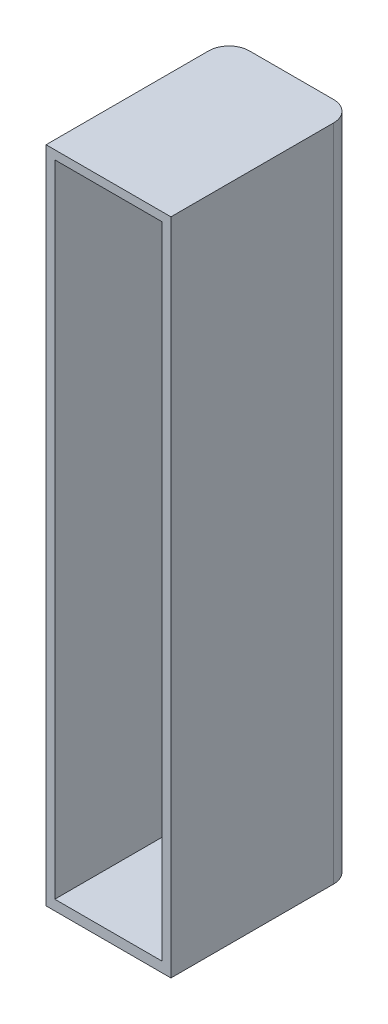
ISO-10303-21;
HEADER;
FILE_DESCRIPTION(('STEP AP214'),'2;1');
FILE_NAME('part.step','',(''),(''),'','','');
FILE_SCHEMA(('AUTOMOTIVE_DESIGN { 1 0 10303 214 1 1 1 1 }'));
ENDSEC;
DATA;
#1=APPLICATION_CONTEXT('core data for automotive mechanical design processes');
#2=APPLICATION_PROTOCOL_DEFINITION('international standard','automotive_design',2000,#1);
#3=PRODUCT_CONTEXT('',#1,'mechanical');
#4=PRODUCT('Part','Part','',(#3));
#5=PRODUCT_RELATED_PRODUCT_CATEGORY('part','',(#4));
#6=PRODUCT_DEFINITION_FORMATION('','',#4);
#7=PRODUCT_DEFINITION_CONTEXT('part definition',#1,'design');
#8=PRODUCT_DEFINITION('design','',#6,#7);
#9=PRODUCT_DEFINITION_SHAPE('','',#8);
#10=(LENGTH_UNIT() NAMED_UNIT(*) SI_UNIT(.MILLI.,.METRE.));
#11=(NAMED_UNIT(*) PLANE_ANGLE_UNIT() SI_UNIT($,.RADIAN.));
#12=(NAMED_UNIT(*) SI_UNIT($,.STERADIAN.) SOLID_ANGLE_UNIT());
#13=UNCERTAINTY_MEASURE_WITH_UNIT(LENGTH_MEASURE(1.E-05),#10,'distance_accuracy_value','');
#14=(GEOMETRIC_REPRESENTATION_CONTEXT(3) GLOBAL_UNCERTAINTY_ASSIGNED_CONTEXT((#13)) GLOBAL_UNIT_ASSIGNED_CONTEXT((#10,
#11,#12)) REPRESENTATION_CONTEXT('',''));
#15=CARTESIAN_POINT('',(0.,0.,0.));
#16=DIRECTION('',(0.,0.,1.));
#17=DIRECTION('',(1.,0.,0.));
#18=AXIS2_PLACEMENT_3D('',#15,#16,#17);
#19=CARTESIAN_POINT('',(-10.75,-0.00999999999999612,15.));
#20=DIRECTION('',(0.,0.,1.));
#21=DIRECTION('',(1.,0.,0.));
#22=AXIS2_PLACEMENT_3D('',#19,#20,#21);
#23=PLANE('',#22);
#24=DIRECTION('',(0.,-1.,0.));
#25=VECTOR('',#24,1.);
#26=CARTESIAN_POINT('',(-9.25,113.5,15.));
#27=LINE('',#26,#25);
#28=CARTESIAN_POINT('',(-9.25,112.,15.));
#29=VERTEX_POINT('',#28);
#30=CARTESIAN_POINT('',(-9.25,1.75000000000003,15.));
#31=VERTEX_POINT('',#30);
#32=EDGE_CURVE('E213',#29,#31,#27,.T.);
#33=ORIENTED_EDGE('',*,*,#32,.F.);
#34=DIRECTION('',(-1.,0.,0.));
#35=VECTOR('',#34,1.);
#36=CARTESIAN_POINT('',(-7.25,112.,15.));
#37=LINE('',#36,#35);
#38=CARTESIAN_POINT('',(9.25,112.,15.));
#39=VERTEX_POINT('',#38);
#40=EDGE_CURVE('E217',#39,#29,#37,.T.);
#41=ORIENTED_EDGE('',*,*,#40,.F.);
#42=DIRECTION('',(0.,-1.,0.));
#43=VECTOR('',#42,1.);
#44=CARTESIAN_POINT('',(9.25,113.5,15.));
#45=LINE('',#44,#43);
#46=CARTESIAN_POINT('',(9.25,1.75,15.));
#47=VERTEX_POINT('',#46);
#48=EDGE_CURVE('E45',#39,#47,#45,.T.);
#49=ORIENTED_EDGE('',*,*,#48,.T.);
#50=DIRECTION('',(1.,0.,0.));
#51=VECTOR('',#50,1.);
#52=CARTESIAN_POINT('',(-9.25,1.75,15.));
#53=LINE('',#52,#51);
#54=EDGE_CURVE('E206',#31,#47,#53,.T.);
#55=ORIENTED_EDGE('',*,*,#54,.F.);
#56=EDGE_LOOP('',(#33,#41,#49,#55));
#57=FACE_BOUND('',#56,.T.);
#58=DIRECTION('',(-1.,0.,0.));
#59=VECTOR('',#58,1.);
#60=CARTESIAN_POINT('',(7.25,0.,15.));
#61=LINE('',#60,#59);
#62=CARTESIAN_POINT('',(10.75,0.,15.));
#63=VERTEX_POINT('',#62);
#64=CARTESIAN_POINT('',(-10.75,0.,15.));
#65=VERTEX_POINT('',#64);
#66=EDGE_CURVE('E195',#63,#65,#61,.T.);
#67=ORIENTED_EDGE('',*,*,#66,.F.);
#68=DIRECTION('',(0.,-1.,0.));
#69=VECTOR('',#68,1.);
#70=CARTESIAN_POINT('',(10.75,113.5,15.));
#71=LINE('',#70,#69);
#72=CARTESIAN_POINT('',(10.75,113.5,15.));
#73=VERTEX_POINT('',#72);
#74=EDGE_CURVE('E210',#73,#63,#71,.T.);
#75=ORIENTED_EDGE('',*,*,#74,.F.);
#76=DIRECTION('',(1.,0.,0.));
#77=VECTOR('',#76,1.);
#78=CARTESIAN_POINT('',(-7.25,113.5,15.));
#79=LINE('',#78,#77);
#80=CARTESIAN_POINT('',(-10.75,113.5,15.));
#81=VERTEX_POINT('',#80);
#82=EDGE_CURVE('E199',#81,#73,#79,.T.);
#83=ORIENTED_EDGE('',*,*,#82,.F.);
#84=DIRECTION('',(0.,-1.,0.));
#85=VECTOR('',#84,1.);
#86=CARTESIAN_POINT('',(-10.75,113.5,15.));
#87=LINE('',#86,#85);
#88=EDGE_CURVE('E184',#81,#65,#87,.T.);
#89=ORIENTED_EDGE('',*,*,#88,.T.);
#90=EDGE_LOOP('',(#67,#75,#83,#89));
#91=FACE_BOUND('',#90,.T.);
#92=ADVANCED_FACE('F41',(#57,#91),#23,.T.);
#93=CARTESIAN_POINT('',(8.34999999999999,106.5,16.501));
#94=DIRECTION('',(1.,0.,0.));
#95=DIRECTION('',(0.,1.,0.));
#96=AXIS2_PLACEMENT_3D('',#93,#94,#95);
#97=PLANE('',#96);
#98=DIRECTION('',(0.,-1.,0.));
#99=VECTOR('',#98,1.);
#100=CARTESIAN_POINT('',(8.34999999999999,113.5,-16.3226495451672));
#101=LINE('',#100,#99);
#102=CARTESIAN_POINT('',(8.34999999999999,106.5,-16.3226495451672));
#103=VERTEX_POINT('',#102);
#104=CARTESIAN_POINT('',(8.34999999999999,72.5,-16.3226495451672));
#105=VERTEX_POINT('',#104);
#106=EDGE_CURVE('E50',#103,#105,#101,.T.);
#107=ORIENTED_EDGE('',*,*,#106,.T.);
#108=DIRECTION('',(0.,0.,-1.));
#109=VECTOR('',#108,1.);
#110=CARTESIAN_POINT('',(8.34999999999999,72.5,16.501));
#111=LINE('',#110,#109);
#112=CARTESIAN_POINT('',(8.34999999999999,72.5,-14.670329308849));
#113=VERTEX_POINT('',#112);
#114=EDGE_CURVE('E251',#113,#105,#111,.T.);
#115=ORIENTED_EDGE('',*,*,#114,.F.);
#116=DIRECTION('',(0.,-1.,0.));
#117=VECTOR('',#116,1.);
#118=CARTESIAN_POINT('',(8.34999999999999,113.5,-14.670329308849));
#119=LINE('',#118,#117);
#120=CARTESIAN_POINT('',(8.34999999999999,106.5,-14.670329308849));
#121=VERTEX_POINT('',#120);
#122=EDGE_CURVE('E230',#121,#113,#119,.T.);
#123=ORIENTED_EDGE('',*,*,#122,.F.);
#124=DIRECTION('',(0.,0.,-1.));
#125=VECTOR('',#124,1.);
#126=CARTESIAN_POINT('',(8.34999999999999,106.5,16.501));
#127=LINE('',#126,#125);
#128=EDGE_CURVE('E254',#121,#103,#127,.T.);
#129=ORIENTED_EDGE('',*,*,#128,.T.);
#130=EDGE_LOOP('',(#107,#115,#123,#129));
#131=FACE_BOUND('',#130,.T.);
#132=ADVANCED_FACE('F391',(#131),#97,.F.);
#133=CARTESIAN_POINT('',(8.34999999999999,72.5,16.501));
#134=DIRECTION('',(0.,-1.,0.));
#135=DIRECTION('',(0.,0.,-1.));
#136=AXIS2_PLACEMENT_3D('',#133,#134,#135);
#137=PLANE('',#136);
#138=CARTESIAN_POINT('',(-7.25,72.5,-13.));
#139=DIRECTION('',(0.,-1.,0.));
#140=DIRECTION('',(0.,0.,-1.));
#141=AXIS2_PLACEMENT_3D('',#138,#139,#140);
#142=CIRCLE('',#141,3.5);
#143=CARTESIAN_POINT('',(-7.24999999999999,72.5,-16.5));
#144=VERTEX_POINT('',#143);
#145=CARTESIAN_POINT('',(-8.35,72.5,-16.3226495451672));
#146=VERTEX_POINT('',#145);
#147=EDGE_CURVE('E228',#144,#146,#142,.F.);
#148=ORIENTED_EDGE('',*,*,#147,.T.);
#149=DIRECTION('',(0.,0.,-1.));
#150=VECTOR('',#149,1.);
#151=CARTESIAN_POINT('',(-8.35000000000001,72.5,16.501));
#152=LINE('',#151,#150);
#153=CARTESIAN_POINT('',(-8.35,72.5,-14.670329308849));
#154=VERTEX_POINT('',#153);
#155=EDGE_CURVE('E248',#154,#146,#152,.T.);
#156=ORIENTED_EDGE('',*,*,#155,.F.);
#157=CARTESIAN_POINT('',(-7.25,72.5,-13.));
#158=DIRECTION('',(0.,-1.,0.));
#159=DIRECTION('',(0.,0.,-1.));
#160=AXIS2_PLACEMENT_3D('',#157,#158,#159);
#161=CIRCLE('',#160,2.);
#162=CARTESIAN_POINT('',(-7.24999999999999,72.5,-15.));
#163=VERTEX_POINT('',#162);
#164=EDGE_CURVE('E242',#163,#154,#161,.F.);
#165=ORIENTED_EDGE('',*,*,#164,.F.);
#166=DIRECTION('',(-1.,0.,0.));
#167=VECTOR('',#166,1.);
#168=CARTESIAN_POINT('',(8.34999999999999,72.5,-15.));
#169=LINE('',#168,#167);
#170=CARTESIAN_POINT('',(7.24999999999998,72.5,-15.));
#171=VERTEX_POINT('',#170);
#172=EDGE_CURVE('E236',#171,#163,#169,.T.);
#173=ORIENTED_EDGE('',*,*,#172,.F.);
#174=CARTESIAN_POINT('',(7.25,72.5,-13.));
#175=DIRECTION('',(0.,-1.,0.));
#176=DIRECTION('',(0.,0.,-1.));
#177=AXIS2_PLACEMENT_3D('',#174,#175,#176);
#178=CIRCLE('',#177,2.);
#179=EDGE_CURVE('E233',#113,#171,#178,.F.);
#180=ORIENTED_EDGE('',*,*,#179,.F.);
#181=ORIENTED_EDGE('',*,*,#114,.T.);
#182=CARTESIAN_POINT('',(7.25,72.5,-13.));
#183=DIRECTION('',(0.,-1.,0.));
#184=DIRECTION('',(0.,0.,-1.));
#185=AXIS2_PLACEMENT_3D('',#182,#183,#184);
#186=CIRCLE('',#185,3.5);
#187=CARTESIAN_POINT('',(7.24999999999997,72.5,-16.5));
#188=VERTEX_POINT('',#187);
#189=EDGE_CURVE('E222',#105,#188,#186,.F.);
#190=ORIENTED_EDGE('',*,*,#189,.T.);
#191=DIRECTION('',(-1.,0.,0.));
#192=VECTOR('',#191,1.);
#193=CARTESIAN_POINT('',(8.34999999999999,72.5,-16.5));
#194=LINE('',#193,#192);
#195=EDGE_CURVE('E65',#188,#144,#194,.T.);
#196=ORIENTED_EDGE('',*,*,#195,.T.);
#197=EDGE_LOOP('',(#148,#156,#165,#173,#180,#181,#190,#196));
#198=FACE_BOUND('',#197,.T.);
#199=ADVANCED_FACE('F366',(#198),#137,.F.);
#200=CARTESIAN_POINT('',(-8.35,106.5,16.501));
#201=DIRECTION('',(-1.,0.,0.));
#202=DIRECTION('',(0.,-1.,0.));
#203=AXIS2_PLACEMENT_3D('',#200,#201,#202);
#204=PLANE('',#203);
#205=DIRECTION('',(0.,-1.,0.));
#206=VECTOR('',#205,1.);
#207=CARTESIAN_POINT('',(-8.35,113.5,-16.3226495451672));
#208=LINE('',#207,#206);
#209=CARTESIAN_POINT('',(-8.35,106.5,-16.3226495451672));
#210=VERTEX_POINT('',#209);
#211=EDGE_CURVE('E226',#146,#210,#208,.F.);
#212=ORIENTED_EDGE('',*,*,#211,.T.);
#213=DIRECTION('',(0.,0.,-1.));
#214=VECTOR('',#213,1.);
#215=CARTESIAN_POINT('',(-8.35,106.5,16.501));
#216=LINE('',#215,#214);
#217=CARTESIAN_POINT('',(-8.35,106.5,-14.670329308849));
#218=VERTEX_POINT('',#217);
#219=EDGE_CURVE('E247',#218,#210,#216,.T.);
#220=ORIENTED_EDGE('',*,*,#219,.F.);
#221=DIRECTION('',(0.,-1.,0.));
#222=VECTOR('',#221,1.);
#223=CARTESIAN_POINT('',(-8.35,113.5,-14.670329308849));
#224=LINE('',#223,#222);
#225=EDGE_CURVE('E239',#154,#218,#224,.F.);
#226=ORIENTED_EDGE('',*,*,#225,.F.);
#227=ORIENTED_EDGE('',*,*,#155,.T.);
#228=EDGE_LOOP('',(#212,#220,#226,#227));
#229=FACE_BOUND('',#228,.T.);
#230=ADVANCED_FACE('F364',(#229),#204,.F.);
#231=CARTESIAN_POINT('',(8.34999999999999,106.5,16.501));
#232=DIRECTION('',(0.,1.,0.));
#233=DIRECTION('',(0.,0.,1.));
#234=AXIS2_PLACEMENT_3D('',#231,#232,#233);
#235=PLANE('',#234);
#236=CARTESIAN_POINT('',(-7.25,106.5,-13.));
#237=DIRECTION('',(0.,1.,0.));
#238=DIRECTION('',(0.,0.,1.));
#239=AXIS2_PLACEMENT_3D('',#236,#237,#238);
#240=CIRCLE('',#239,3.5);
#241=CARTESIAN_POINT('',(-7.25,106.5,-16.5));
#242=VERTEX_POINT('',#241);
#243=EDGE_CURVE('E224',#210,#242,#240,.F.);
#244=ORIENTED_EDGE('',*,*,#243,.T.);
#245=DIRECTION('',(1.,0.,0.));
#246=VECTOR('',#245,1.);
#247=CARTESIAN_POINT('',(8.34999999999999,106.5,-16.5));
#248=LINE('',#247,#246);
#249=CARTESIAN_POINT('',(7.24999999999997,106.5,-16.5));
#250=VERTEX_POINT('',#249);
#251=EDGE_CURVE('E57',#242,#250,#248,.T.);
#252=ORIENTED_EDGE('',*,*,#251,.T.);
#253=CARTESIAN_POINT('',(7.25,106.5,-13.));
#254=DIRECTION('',(0.,1.,0.));
#255=DIRECTION('',(0.,0.,1.));
#256=AXIS2_PLACEMENT_3D('',#253,#254,#255);
#257=CIRCLE('',#256,3.5);
#258=EDGE_CURVE('E11',#250,#103,#257,.F.);
#259=ORIENTED_EDGE('',*,*,#258,.T.);
#260=ORIENTED_EDGE('',*,*,#128,.F.);
#261=CARTESIAN_POINT('',(7.25,106.5,-13.));
#262=DIRECTION('',(0.,1.,0.));
#263=DIRECTION('',(0.,0.,1.));
#264=AXIS2_PLACEMENT_3D('',#261,#262,#263);
#265=CIRCLE('',#264,2.);
#266=CARTESIAN_POINT('',(7.24999999999998,106.5,-15.));
#267=VERTEX_POINT('',#266);
#268=EDGE_CURVE('E252',#267,#121,#265,.F.);
#269=ORIENTED_EDGE('',*,*,#268,.F.);
#270=DIRECTION('',(1.,0.,0.));
#271=VECTOR('',#270,1.);
#272=CARTESIAN_POINT('',(8.34999999999999,106.5,-15.));
#273=LINE('',#272,#271);
#274=CARTESIAN_POINT('',(-7.24999999999999,106.5,-15.));
#275=VERTEX_POINT('',#274);
#276=EDGE_CURVE('E260',#275,#267,#273,.T.);
#277=ORIENTED_EDGE('',*,*,#276,.F.);
#278=CARTESIAN_POINT('',(-7.25,106.5,-13.));
#279=DIRECTION('',(0.,1.,0.));
#280=DIRECTION('',(0.,0.,1.));
#281=AXIS2_PLACEMENT_3D('',#278,#279,#280);
#282=CIRCLE('',#281,2.);
#283=EDGE_CURVE('E263',#218,#275,#282,.F.);
#284=ORIENTED_EDGE('',*,*,#283,.F.);
#285=ORIENTED_EDGE('',*,*,#219,.T.);
#286=EDGE_LOOP('',(#244,#252,#259,#260,#269,#277,#284,#285));
#287=FACE_BOUND('',#286,.T.);
#288=ADVANCED_FACE('F356',(#287),#235,.F.);
#289=CARTESIAN_POINT('',(-7.24999999999999,113.5,-16.5));
#290=DIRECTION('',(0.,0.,1.));
#291=DIRECTION('',(1.,0.,0.));
#292=AXIS2_PLACEMENT_3D('',#289,#290,#291);
#293=PLANE('',#292);
#294=DIRECTION('',(0.,-1.,0.));
#295=VECTOR('',#294,1.);
#296=CARTESIAN_POINT('',(7.24999999999997,113.5,-16.5));
#297=LINE('',#296,#295);
#298=CARTESIAN_POINT('',(7.24999999999997,113.5,-16.5));
#299=VERTEX_POINT('',#298);
#300=EDGE_CURVE('E313',#299,#250,#297,.T.);
#301=ORIENTED_EDGE('',*,*,#300,.T.);
#302=ORIENTED_EDGE('',*,*,#251,.F.);
#303=DIRECTION('',(0.,-1.,0.));
#304=VECTOR('',#303,1.);
#305=CARTESIAN_POINT('',(-7.24999999999999,113.5,-16.5));
#306=LINE('',#305,#304);
#307=CARTESIAN_POINT('',(-7.24999999999999,113.5,-16.5));
#308=VERTEX_POINT('',#307);
#309=EDGE_CURVE('E309',#308,#242,#306,.T.);
#310=ORIENTED_EDGE('',*,*,#309,.F.);
#311=DIRECTION('',(-1.,0.,0.));
#312=VECTOR('',#311,1.);
#313=CARTESIAN_POINT('',(-7.24999999999999,113.5,-16.5));
#314=LINE('',#313,#312);
#315=EDGE_CURVE('E299',#299,#308,#314,.T.);
#316=ORIENTED_EDGE('',*,*,#315,.F.);
#317=EDGE_LOOP('',(#301,#302,#310,#316));
#318=FACE_BOUND('',#317,.T.);
#319=ADVANCED_FACE('F383',(#318),#293,.F.);
#320=CARTESIAN_POINT('',(-7.25,113.5,-13.));
#321=DIRECTION('',(0.,1.,0.));
#322=DIRECTION('',(0.,0.,1.));
#323=AXIS2_PLACEMENT_3D('',#320,#321,#322);
#324=PLANE('',#323);
#325=DIRECTION('',(0.,0.,1.));
#326=VECTOR('',#325,1.);
#327=CARTESIAN_POINT('',(-10.75,113.5,-13.));
#328=LINE('',#327,#326);
#329=CARTESIAN_POINT('',(-10.75,113.5,-13.));
#330=VERTEX_POINT('',#329);
#331=EDGE_CURVE('E293',#330,#81,#328,.T.);
#332=ORIENTED_EDGE('',*,*,#331,.T.);
#333=ORIENTED_EDGE('',*,*,#82,.T.);
#334=DIRECTION('',(0.,0.,-1.));
#335=VECTOR('',#334,1.);
#336=CARTESIAN_POINT('',(10.75,113.5,-13.));
#337=LINE('',#336,#335);
#338=CARTESIAN_POINT('',(10.75,113.5,-13.));
#339=VERTEX_POINT('',#338);
#340=EDGE_CURVE('E295',#73,#339,#337,.T.);
#341=ORIENTED_EDGE('',*,*,#340,.T.);
#342=CARTESIAN_POINT('',(7.25,113.5,-13.));
#343=DIRECTION('',(0.,1.,0.));
#344=DIRECTION('',(0.,0.,-1.));
#345=AXIS2_PLACEMENT_3D('',#342,#343,#344);
#346=CIRCLE('',#345,3.5);
#347=EDGE_CURVE('E297',#339,#299,#346,.T.);
#348=ORIENTED_EDGE('',*,*,#347,.T.);
#349=ORIENTED_EDGE('',*,*,#315,.T.);
#350=CARTESIAN_POINT('',(-7.25,113.5,-13.));
#351=DIRECTION('',(0.,1.,0.));
#352=DIRECTION('',(0.,0.,1.));
#353=AXIS2_PLACEMENT_3D('',#350,#351,#352);
#354=CIRCLE('',#353,3.5);
#355=EDGE_CURVE('E289',#308,#330,#354,.T.);
#356=ORIENTED_EDGE('',*,*,#355,.T.);
#357=EDGE_LOOP('',(#332,#333,#341,#348,#349,#356));
#358=FACE_BOUND('',#357,.T.);
#359=ADVANCED_FACE('F378',(#358),#324,.T.);
#360=CARTESIAN_POINT('',(7.25,113.5,-13.));
#361=DIRECTION('',(0.,-1.,0.));
#362=DIRECTION('',(0.,0.,-1.));
#363=AXIS2_PLACEMENT_3D('',#360,#361,#362);
#364=CYLINDRICAL_SURFACE('',#363,3.5);
#365=ORIENTED_EDGE('',*,*,#106,.F.);
#366=ORIENTED_EDGE('',*,*,#258,.F.);
#367=ORIENTED_EDGE('',*,*,#300,.F.);
#368=ORIENTED_EDGE('',*,*,#347,.F.);
#369=DIRECTION('',(0.,-1.,0.));
#370=VECTOR('',#369,1.);
#371=CARTESIAN_POINT('',(10.75,113.5,-13.));
#372=LINE('',#371,#370);
#373=CARTESIAN_POINT('',(10.75,0.,-13.));
#374=VERTEX_POINT('',#373);
#375=EDGE_CURVE('E212',#339,#374,#372,.T.);
#376=ORIENTED_EDGE('',*,*,#375,.T.);
#377=CARTESIAN_POINT('',(7.25,0.,-13.));
#378=DIRECTION('',(0.,1.,0.));
#379=DIRECTION('',(0.,0.,-1.));
#380=AXIS2_PLACEMENT_3D('',#377,#378,#379);
#381=CIRCLE('',#380,3.5);
#382=CARTESIAN_POINT('',(7.24999999999997,0.,-16.5));
#383=VERTEX_POINT('',#382);
#384=EDGE_CURVE('E304',#374,#383,#381,.T.);
#385=ORIENTED_EDGE('',*,*,#384,.T.);
#386=EDGE_CURVE('E312',#188,#383,#297,.T.);
#387=ORIENTED_EDGE('',*,*,#386,.F.);
#388=ORIENTED_EDGE('',*,*,#189,.F.);
#389=EDGE_LOOP('',(#365,#366,#367,#368,#376,#385,#387,#388));
#390=FACE_BOUND('',#389,.T.);
#391=ADVANCED_FACE('F386',(#390),#364,.T.);
#392=CARTESIAN_POINT('',(-7.24999999999999,0.,-16.5));
#393=VERTEX_POINT('',#392);
#394=EDGE_CURVE('E301',#144,#393,#306,.T.);
#395=ORIENTED_EDGE('',*,*,#394,.F.);
#396=ORIENTED_EDGE('',*,*,#195,.F.);
#397=ORIENTED_EDGE('',*,*,#386,.T.);
#398=DIRECTION('',(-1.,0.,0.));
#399=VECTOR('',#398,1.);
#400=CARTESIAN_POINT('',(-7.24999999999999,0.,-16.5));
#401=LINE('',#400,#399);
#402=EDGE_CURVE('E292',#383,#393,#401,.T.);
#403=ORIENTED_EDGE('',*,*,#402,.T.);
#404=EDGE_LOOP('',(#395,#396,#397,#403));
#405=FACE_BOUND('',#404,.T.);
#406=ADVANCED_FACE('F372',(#405),#293,.F.);
#407=CARTESIAN_POINT('',(-7.25,113.5,-13.));
#408=DIRECTION('',(0.,-1.,0.));
#409=DIRECTION('',(0.,0.,-1.));
#410=AXIS2_PLACEMENT_3D('',#407,#408,#409);
#411=CYLINDRICAL_SURFACE('',#410,3.5);
#412=ORIENTED_EDGE('',*,*,#309,.T.);
#413=ORIENTED_EDGE('',*,*,#243,.F.);
#414=ORIENTED_EDGE('',*,*,#211,.F.);
#415=ORIENTED_EDGE('',*,*,#147,.F.);
#416=ORIENTED_EDGE('',*,*,#394,.T.);
#417=CARTESIAN_POINT('',(-7.25,0.,-13.));
#418=DIRECTION('',(0.,1.,0.));
#419=DIRECTION('',(0.,0.,1.));
#420=AXIS2_PLACEMENT_3D('',#417,#418,#419);
#421=CIRCLE('',#420,3.5);
#422=CARTESIAN_POINT('',(-10.75,0.,-13.));
#423=VERTEX_POINT('',#422);
#424=EDGE_CURVE('E190',#393,#423,#421,.T.);
#425=ORIENTED_EDGE('',*,*,#424,.T.);
#426=DIRECTION('',(0.,-1.,0.));
#427=VECTOR('',#426,1.);
#428=CARTESIAN_POINT('',(-10.75,113.5,-13.));
#429=LINE('',#428,#427);
#430=EDGE_CURVE('E186',#330,#423,#429,.T.);
#431=ORIENTED_EDGE('',*,*,#430,.F.);
#432=ORIENTED_EDGE('',*,*,#355,.F.);
#433=EDGE_LOOP('',(#412,#413,#414,#415,#416,#425,#431,#432));
#434=FACE_BOUND('',#433,.T.);
#435=ADVANCED_FACE('F369',(#434),#411,.T.);
#436=CARTESIAN_POINT('',(-10.75,113.5,-13.));
#437=DIRECTION('',(1.,0.,0.));
#438=DIRECTION('',(0.,0.,-1.));
#439=AXIS2_PLACEMENT_3D('',#436,#437,#438);
#440=PLANE('',#439);
#441=DIRECTION('',(0.,0.,1.));
#442=VECTOR('',#441,1.);
#443=CARTESIAN_POINT('',(-10.75,0.,-13.));
#444=LINE('',#443,#442);
#445=EDGE_CURVE('E180',#423,#65,#444,.T.);
#446=ORIENTED_EDGE('',*,*,#445,.T.);
#447=ORIENTED_EDGE('',*,*,#88,.F.);
#448=ORIENTED_EDGE('',*,*,#331,.F.);
#449=ORIENTED_EDGE('',*,*,#430,.T.);
#450=EDGE_LOOP('',(#446,#447,#448,#449));
#451=FACE_BOUND('',#450,.T.);
#452=ADVANCED_FACE('F182',(#451),#440,.F.);
#453=CARTESIAN_POINT('',(10.75,113.5,-13.));
#454=DIRECTION('',(-1.,0.,0.));
#455=DIRECTION('',(0.,0.,1.));
#456=AXIS2_PLACEMENT_3D('',#453,#454,#455);
#457=PLANE('',#456);
#458=DIRECTION('',(0.,0.,-1.));
#459=VECTOR('',#458,1.);
#460=CARTESIAN_POINT('',(10.75,0.,-13.));
#461=LINE('',#460,#459);
#462=EDGE_CURVE('E191',#63,#374,#461,.T.);
#463=ORIENTED_EDGE('',*,*,#462,.T.);
#464=ORIENTED_EDGE('',*,*,#375,.F.);
#465=ORIENTED_EDGE('',*,*,#340,.F.);
#466=ORIENTED_EDGE('',*,*,#74,.T.);
#467=EDGE_LOOP('',(#463,#464,#465,#466));
#468=FACE_BOUND('',#467,.T.);
#469=ADVANCED_FACE('F433',(#468),#457,.F.);
#470=CARTESIAN_POINT('',(7.25,0.,-13.));
#471=DIRECTION('',(0.,-1.,0.));
#472=DIRECTION('',(0.,0.,-1.));
#473=AXIS2_PLACEMENT_3D('',#470,#471,#472);
#474=PLANE('',#473);
#475=ORIENTED_EDGE('',*,*,#462,.F.);
#476=ORIENTED_EDGE('',*,*,#66,.T.);
#477=ORIENTED_EDGE('',*,*,#445,.F.);
#478=ORIENTED_EDGE('',*,*,#424,.F.);
#479=ORIENTED_EDGE('',*,*,#402,.F.);
#480=ORIENTED_EDGE('',*,*,#384,.F.);
#481=EDGE_LOOP('',(#475,#476,#477,#478,#479,#480));
#482=FACE_BOUND('',#481,.T.);
#483=ADVANCED_FACE('F43',(#482),#474,.T.);
#484=CARTESIAN_POINT('',(-7.24999999999999,113.5,-15.));
#485=DIRECTION('',(0.,0.,1.));
#486=DIRECTION('',(1.,0.,0.));
#487=AXIS2_PLACEMENT_3D('',#484,#485,#486);
#488=PLANE('',#487);
#489=ORIENTED_EDGE('',*,*,#276,.T.);
#490=DIRECTION('',(0.,-1.,0.));
#491=VECTOR('',#490,1.);
#492=CARTESIAN_POINT('',(7.24999999999998,113.5,-15.));
#493=LINE('',#492,#491);
#494=CARTESIAN_POINT('',(7.24999999999998,112.,-15.));
#495=VERTEX_POINT('',#494);
#496=EDGE_CURVE('E284',#495,#267,#493,.T.);
#497=ORIENTED_EDGE('',*,*,#496,.F.);
#498=DIRECTION('',(-1.,0.,0.));
#499=VECTOR('',#498,1.);
#500=CARTESIAN_POINT('',(-7.25,112.,-15.));
#501=LINE('',#500,#499);
#502=CARTESIAN_POINT('',(-7.24999999999999,112.,-15.));
#503=VERTEX_POINT('',#502);
#504=EDGE_CURVE('E269',#495,#503,#501,.T.);
#505=ORIENTED_EDGE('',*,*,#504,.T.);
#506=DIRECTION('',(0.,-1.,0.));
#507=VECTOR('',#506,1.);
#508=CARTESIAN_POINT('',(-7.24999999999999,113.5,-15.));
#509=LINE('',#508,#507);
#510=EDGE_CURVE('E280',#503,#275,#509,.T.);
#511=ORIENTED_EDGE('',*,*,#510,.T.);
#512=EDGE_LOOP('',(#489,#497,#505,#511));
#513=FACE_BOUND('',#512,.T.);
#514=ADVANCED_FACE('F354',(#513),#488,.T.);
#515=ORIENTED_EDGE('',*,*,#172,.T.);
#516=CARTESIAN_POINT('',(-7.24999999999999,1.75000000000003,-15.));
#517=VERTEX_POINT('',#516);
#518=EDGE_CURVE('E279',#163,#517,#509,.T.);
#519=ORIENTED_EDGE('',*,*,#518,.T.);
#520=DIRECTION('',(1.,0.,0.));
#521=VECTOR('',#520,1.);
#522=CARTESIAN_POINT('',(-7.24999999999999,1.75,-15.));
#523=LINE('',#522,#521);
#524=CARTESIAN_POINT('',(7.24999999999998,1.75000000000003,-15.));
#525=VERTEX_POINT('',#524);
#526=EDGE_CURVE('E323',#517,#525,#523,.T.);
#527=ORIENTED_EDGE('',*,*,#526,.T.);
#528=EDGE_CURVE('E283',#171,#525,#493,.T.);
#529=ORIENTED_EDGE('',*,*,#528,.F.);
#530=EDGE_LOOP('',(#515,#519,#527,#529));
#531=FACE_BOUND('',#530,.T.);
#532=ADVANCED_FACE('F393',(#531),#488,.T.);
#533=CARTESIAN_POINT('',(7.25,1.75,-13.));
#534=DIRECTION('',(0.,-1.,0.));
#535=DIRECTION('',(0.,0.,-1.));
#536=AXIS2_PLACEMENT_3D('',#533,#534,#535);
#537=PLANE('',#536);
#538=ORIENTED_EDGE('',*,*,#54,.T.);
#539=DIRECTION('',(0.,0.,1.));
#540=VECTOR('',#539,1.);
#541=CARTESIAN_POINT('',(9.25,1.75,-13.));
#542=LINE('',#541,#540);
#543=CARTESIAN_POINT('',(9.25,1.75000000000003,-13.));
#544=VERTEX_POINT('',#543);
#545=EDGE_CURVE('E209',#544,#47,#542,.T.);
#546=ORIENTED_EDGE('',*,*,#545,.F.);
#547=CARTESIAN_POINT('',(7.25,1.75,-13.));
#548=DIRECTION('',(0.,-1.,0.));
#549=DIRECTION('',(0.,0.,-1.));
#550=AXIS2_PLACEMENT_3D('',#547,#548,#549);
#551=CIRCLE('',#550,2.);
#552=EDGE_CURVE('E320',#525,#544,#551,.T.);
#553=ORIENTED_EDGE('',*,*,#552,.F.);
#554=ORIENTED_EDGE('',*,*,#526,.F.);
#555=CARTESIAN_POINT('',(-7.25,1.75,-13.));
#556=DIRECTION('',(0.,1.,0.));
#557=DIRECTION('',(0.,0.,1.));
#558=AXIS2_PLACEMENT_3D('',#555,#556,#557);
#559=CIRCLE('',#558,2.);
#560=CARTESIAN_POINT('',(-9.25,1.75000000000003,-13.));
#561=VERTEX_POINT('',#560);
#562=EDGE_CURVE('E326',#517,#561,#559,.T.);
#563=ORIENTED_EDGE('',*,*,#562,.T.);
#564=DIRECTION('',(0.,0.,1.));
#565=VECTOR('',#564,1.);
#566=CARTESIAN_POINT('',(-9.25,1.75,-13.));
#567=LINE('',#566,#565);
#568=EDGE_CURVE('E198',#561,#31,#567,.T.);
#569=ORIENTED_EDGE('',*,*,#568,.T.);
#570=EDGE_LOOP('',(#538,#546,#553,#554,#563,#569));
#571=FACE_BOUND('',#570,.T.);
#572=ADVANCED_FACE('F332',(#571),#537,.F.);
#573=CARTESIAN_POINT('',(7.25,113.5,-13.));
#574=DIRECTION('',(0.,-1.,0.));
#575=DIRECTION('',(0.,0.,-1.));
#576=AXIS2_PLACEMENT_3D('',#573,#574,#575);
#577=CYLINDRICAL_SURFACE('',#576,2.);
#578=ORIENTED_EDGE('',*,*,#268,.T.);
#579=ORIENTED_EDGE('',*,*,#122,.T.);
#580=ORIENTED_EDGE('',*,*,#179,.T.);
#581=ORIENTED_EDGE('',*,*,#528,.T.);
#582=ORIENTED_EDGE('',*,*,#552,.T.);
#583=DIRECTION('',(0.,-1.,0.));
#584=VECTOR('',#583,1.);
#585=CARTESIAN_POINT('',(9.25,113.5,-13.));
#586=LINE('',#585,#584);
#587=CARTESIAN_POINT('',(9.25,112.,-13.));
#588=VERTEX_POINT('',#587);
#589=EDGE_CURVE('E287',#588,#544,#586,.T.);
#590=ORIENTED_EDGE('',*,*,#589,.F.);
#591=CARTESIAN_POINT('',(7.25,112.,-13.));
#592=DIRECTION('',(0.,1.,0.));
#593=DIRECTION('',(0.,0.,1.));
#594=AXIS2_PLACEMENT_3D('',#591,#592,#593);
#595=CIRCLE('',#594,2.);
#596=EDGE_CURVE('E266',#588,#495,#595,.T.);
#597=ORIENTED_EDGE('',*,*,#596,.T.);
#598=ORIENTED_EDGE('',*,*,#496,.T.);
#599=EDGE_LOOP('',(#578,#579,#580,#581,#582,#590,#597,#598));
#600=FACE_BOUND('',#599,.T.);
#601=ADVANCED_FACE('F352',(#600),#577,.F.);
#602=CARTESIAN_POINT('',(7.25,112.,-13.));
#603=DIRECTION('',(0.,1.,0.));
#604=DIRECTION('',(0.,0.,1.));
#605=AXIS2_PLACEMENT_3D('',#602,#603,#604);
#606=PLANE('',#605);
#607=ORIENTED_EDGE('',*,*,#596,.F.);
#608=DIRECTION('',(0.,0.,-1.));
#609=VECTOR('',#608,1.);
#610=CARTESIAN_POINT('',(9.25,112.,-13.));
#611=LINE('',#610,#609);
#612=EDGE_CURVE('E215',#39,#588,#611,.T.);
#613=ORIENTED_EDGE('',*,*,#612,.F.);
#614=ORIENTED_EDGE('',*,*,#40,.T.);
#615=DIRECTION('',(0.,0.,-1.));
#616=VECTOR('',#615,1.);
#617=CARTESIAN_POINT('',(-9.25,112.,-13.));
#618=LINE('',#617,#616);
#619=CARTESIAN_POINT('',(-9.25,112.,-13.));
#620=VERTEX_POINT('',#619);
#621=EDGE_CURVE('E218',#29,#620,#618,.T.);
#622=ORIENTED_EDGE('',*,*,#621,.T.);
#623=CARTESIAN_POINT('',(-7.25,112.,-13.));
#624=DIRECTION('',(0.,1.,0.));
#625=DIRECTION('',(0.,0.,1.));
#626=AXIS2_PLACEMENT_3D('',#623,#624,#625);
#627=CIRCLE('',#626,2.);
#628=EDGE_CURVE('E272',#503,#620,#627,.T.);
#629=ORIENTED_EDGE('',*,*,#628,.F.);
#630=ORIENTED_EDGE('',*,*,#504,.F.);
#631=EDGE_LOOP('',(#607,#613,#614,#622,#629,#630));
#632=FACE_BOUND('',#631,.T.);
#633=ADVANCED_FACE('F349',(#632),#606,.F.);
#634=CARTESIAN_POINT('',(9.25,113.5,-13.));
#635=DIRECTION('',(-1.,0.,0.));
#636=DIRECTION('',(0.,0.,1.));
#637=AXIS2_PLACEMENT_3D('',#634,#635,#636);
#638=PLANE('',#637);
#639=ORIENTED_EDGE('',*,*,#48,.F.);
#640=ORIENTED_EDGE('',*,*,#612,.T.);
#641=ORIENTED_EDGE('',*,*,#589,.T.);
#642=ORIENTED_EDGE('',*,*,#545,.T.);
#643=EDGE_LOOP('',(#639,#640,#641,#642));
#644=FACE_BOUND('',#643,.T.);
#645=ADVANCED_FACE('F346',(#644),#638,.T.);
#646=CARTESIAN_POINT('',(-7.25,113.5,-13.));
#647=DIRECTION('',(0.,-1.,0.));
#648=DIRECTION('',(0.,0.,-1.));
#649=AXIS2_PLACEMENT_3D('',#646,#647,#648);
#650=CYLINDRICAL_SURFACE('',#649,2.);
#651=ORIENTED_EDGE('',*,*,#283,.T.);
#652=ORIENTED_EDGE('',*,*,#510,.F.);
#653=ORIENTED_EDGE('',*,*,#628,.T.);
#654=DIRECTION('',(0.,-1.,0.));
#655=VECTOR('',#654,1.);
#656=CARTESIAN_POINT('',(-9.25,113.5,-13.));
#657=LINE('',#656,#655);
#658=EDGE_CURVE('E216',#620,#561,#657,.T.);
#659=ORIENTED_EDGE('',*,*,#658,.T.);
#660=ORIENTED_EDGE('',*,*,#562,.F.);
#661=ORIENTED_EDGE('',*,*,#518,.F.);
#662=ORIENTED_EDGE('',*,*,#164,.T.);
#663=ORIENTED_EDGE('',*,*,#225,.T.);
#664=EDGE_LOOP('',(#651,#652,#653,#659,#660,#661,#662,#663));
#665=FACE_BOUND('',#664,.T.);
#666=ADVANCED_FACE('F360',(#665),#650,.F.);
#667=CARTESIAN_POINT('',(-9.25,113.5,-13.));
#668=DIRECTION('',(1.,0.,0.));
#669=DIRECTION('',(0.,0.,-1.));
#670=AXIS2_PLACEMENT_3D('',#667,#668,#669);
#671=PLANE('',#670);
#672=ORIENTED_EDGE('',*,*,#658,.F.);
#673=ORIENTED_EDGE('',*,*,#621,.F.);
#674=ORIENTED_EDGE('',*,*,#32,.T.);
#675=ORIENTED_EDGE('',*,*,#568,.F.);
#676=EDGE_LOOP('',(#672,#673,#674,#675));
#677=FACE_BOUND('',#676,.T.);
#678=ADVANCED_FACE('F339',(#677),#671,.T.);
#679=CLOSED_SHELL('',(#92,#132,#199,#230,#288,#319,#359,#391,#406,#435,#452,#469,#483,#514,#532,
#572,#601,#633,#645,#666,#678));
#680=MANIFOLD_SOLID_BREP('B2',#679);
#681=ADVANCED_BREP_SHAPE_REPRESENTATION('',(#18,#680),#14);
#682=SHAPE_DEFINITION_REPRESENTATION(#9,#681);
ENDSEC;
END-ISO-10303-21;
